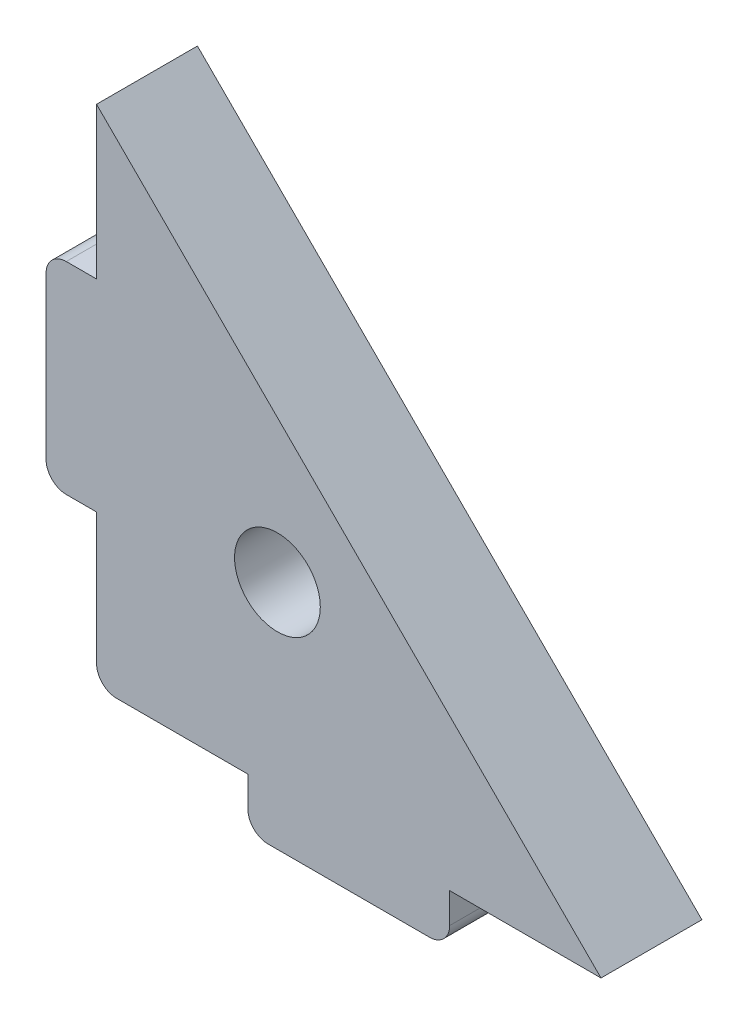
ISO-10303-21;
HEADER;
FILE_DESCRIPTION(('STEP AP214'),'2;1');
FILE_NAME('part.step','',(''),(''),'','','');
FILE_SCHEMA(('AUTOMOTIVE_DESIGN { 1 0 10303 214 1 1 1 1 }'));
ENDSEC;
DATA;
#1=APPLICATION_CONTEXT('core data for automotive mechanical design processes');
#2=APPLICATION_PROTOCOL_DEFINITION('international standard','automotive_design',2000,#1);
#3=PRODUCT_CONTEXT('',#1,'mechanical');
#4=PRODUCT('Part','Part','',(#3));
#5=PRODUCT_RELATED_PRODUCT_CATEGORY('part','',(#4));
#6=PRODUCT_DEFINITION_FORMATION('','',#4);
#7=PRODUCT_DEFINITION_CONTEXT('part definition',#1,'design');
#8=PRODUCT_DEFINITION('design','',#6,#7);
#9=PRODUCT_DEFINITION_SHAPE('','',#8);
#10=(LENGTH_UNIT() NAMED_UNIT(*) SI_UNIT(.MILLI.,.METRE.));
#11=(NAMED_UNIT(*) PLANE_ANGLE_UNIT() SI_UNIT($,.RADIAN.));
#12=(NAMED_UNIT(*) SI_UNIT($,.STERADIAN.) SOLID_ANGLE_UNIT());
#13=UNCERTAINTY_MEASURE_WITH_UNIT(LENGTH_MEASURE(1.E-05),#10,'distance_accuracy_value','');
#14=(GEOMETRIC_REPRESENTATION_CONTEXT(3) GLOBAL_UNCERTAINTY_ASSIGNED_CONTEXT((#13)) GLOBAL_UNIT_ASSIGNED_CONTEXT((#10,
#11,#12)) REPRESENTATION_CONTEXT('',''));
#15=CARTESIAN_POINT('',(0.,0.,0.));
#16=DIRECTION('',(0.,0.,1.));
#17=DIRECTION('',(1.,0.,0.));
#18=AXIS2_PLACEMENT_3D('',#15,#16,#17);
#19=CARTESIAN_POINT('',(0.,0.,10.));
#20=DIRECTION('',(0.,0.,1.));
#21=DIRECTION('',(1.,0.,0.));
#22=AXIS2_PLACEMENT_3D('',#19,#20,#21);
#23=PLANE('',#22);
#24=DIRECTION('',(0.,1.,0.));
#25=VECTOR('',#24,1.);
#26=CARTESIAN_POINT('',(-1.74702691181876,14.5393485831004,10.));
#27=LINE('',#26,#25);
#28=CARTESIAN_POINT('',(-1.74702691181876,16.5393485831004,10.));
#29=VERTEX_POINT('',#28);
#30=CARTESIAN_POINT('',(-1.74702691181876,29.5393485831004,10.));
#31=VERTEX_POINT('',#30);
#32=EDGE_CURVE('E186',#29,#31,#27,.T.);
#33=ORIENTED_EDGE('',*,*,#32,.F.);
#34=CARTESIAN_POINT('',(0.252973088181243,16.5393485831004,10.));
#35=DIRECTION('',(0.,0.,1.));
#36=DIRECTION('',(1.,0.,0.));
#37=AXIS2_PLACEMENT_3D('',#34,#35,#36);
#38=CIRCLE('',#37,2.);
#39=CARTESIAN_POINT('',(0.252973088181243,14.5393485831004,10.));
#40=VERTEX_POINT('',#39);
#41=EDGE_CURVE('E324',#29,#40,#38,.T.);
#42=ORIENTED_EDGE('',*,*,#41,.T.);
#43=DIRECTION('',(1.,0.,0.));
#44=VECTOR('',#43,1.);
#45=CARTESIAN_POINT('',(-1.74702691181876,14.5393485831004,10.));
#46=LINE('',#45,#44);
#47=CARTESIAN_POINT('',(13.2529730881812,14.5393485831004,10.));
#48=VERTEX_POINT('',#47);
#49=EDGE_CURVE('E204',#40,#48,#46,.T.);
#50=ORIENTED_EDGE('',*,*,#49,.T.);
#51=DIRECTION('',(0.,-1.,0.));
#52=VECTOR('',#51,1.);
#53=CARTESIAN_POINT('',(13.2529730881812,14.5393485831004,10.));
#54=LINE('',#53,#52);
#55=CARTESIAN_POINT('',(13.2529730881812,11.5393485831004,10.));
#56=VERTEX_POINT('',#55);
#57=EDGE_CURVE('E255',#48,#56,#54,.T.);
#58=ORIENTED_EDGE('',*,*,#57,.T.);
#59=CARTESIAN_POINT('',(15.2529730881812,11.5393485831004,10.));
#60=DIRECTION('',(0.,0.,1.));
#61=DIRECTION('',(1.,0.,0.));
#62=AXIS2_PLACEMENT_3D('',#59,#60,#61);
#63=CIRCLE('',#62,2.);
#64=CARTESIAN_POINT('',(15.2529730881812,9.53934858310044,10.));
#65=VERTEX_POINT('',#64);
#66=EDGE_CURVE('E226',#56,#65,#63,.T.);
#67=ORIENTED_EDGE('',*,*,#66,.T.);
#68=DIRECTION('',(1.,0.,0.));
#69=VECTOR('',#68,1.);
#70=CARTESIAN_POINT('',(13.2529730881812,9.53934858310044,10.));
#71=LINE('',#70,#69);
#72=CARTESIAN_POINT('',(31.2529730881812,9.53934858310044,10.));
#73=VERTEX_POINT('',#72);
#74=EDGE_CURVE('E251',#65,#73,#71,.T.);
#75=ORIENTED_EDGE('',*,*,#74,.T.);
#76=CARTESIAN_POINT('',(31.2529730881812,11.5393485831004,10.));
#77=DIRECTION('',(0.,0.,1.));
#78=DIRECTION('',(1.,0.,0.));
#79=AXIS2_PLACEMENT_3D('',#76,#77,#78);
#80=CIRCLE('',#79,2.);
#81=CARTESIAN_POINT('',(33.2529730881812,11.5393485831004,10.));
#82=VERTEX_POINT('',#81);
#83=EDGE_CURVE('E327',#73,#82,#80,.T.);
#84=ORIENTED_EDGE('',*,*,#83,.T.);
#85=DIRECTION('',(0.,-1.,0.));
#86=VECTOR('',#85,1.);
#87=CARTESIAN_POINT('',(33.2529730881812,14.5393485831004,10.));
#88=LINE('',#87,#86);
#89=CARTESIAN_POINT('',(33.2529730881812,14.5393485831004,10.));
#90=VERTEX_POINT('',#89);
#91=EDGE_CURVE('E247',#90,#82,#88,.T.);
#92=ORIENTED_EDGE('',*,*,#91,.F.);
#93=DIRECTION('',(1.,0.,0.));
#94=VECTOR('',#93,1.);
#95=CARTESIAN_POINT('',(33.2529730881812,14.5393485831004,10.));
#96=LINE('',#95,#94);
#97=CARTESIAN_POINT('',(48.2529730881797,14.5393485831004,10.));
#98=VERTEX_POINT('',#97);
#99=EDGE_CURVE('E240',#90,#98,#96,.T.);
#100=ORIENTED_EDGE('',*,*,#99,.T.);
#101=DIRECTION('',(-0.707106781186548,0.707106781186547,0.));
#102=VECTOR('',#101,1.);
#103=CARTESIAN_POINT('',(48.2529730881797,14.5393485831004,10.));
#104=LINE('',#103,#102);
#105=CARTESIAN_POINT('',(-1.74702691181876,64.5393485830988,10.));
#106=VERTEX_POINT('',#105);
#107=EDGE_CURVE('E237',#98,#106,#104,.T.);
#108=ORIENTED_EDGE('',*,*,#107,.T.);
#109=DIRECTION('',(0.,-1.,0.));
#110=VECTOR('',#109,1.);
#111=CARTESIAN_POINT('',(-1.74702691181876,64.5393485830988,10.));
#112=LINE('',#111,#110);
#113=CARTESIAN_POINT('',(-1.74702691181876,49.5393485831004,10.));
#114=VERTEX_POINT('',#113);
#115=EDGE_CURVE('E234',#106,#114,#112,.T.);
#116=ORIENTED_EDGE('',*,*,#115,.T.);
#117=DIRECTION('',(-1.,0.,0.));
#118=VECTOR('',#117,1.);
#119=CARTESIAN_POINT('',(-1.74702691181876,49.5393485831004,10.));
#120=LINE('',#119,#118);
#121=CARTESIAN_POINT('',(-4.74702691181876,49.5393485831004,10.));
#122=VERTEX_POINT('',#121);
#123=EDGE_CURVE('E209',#114,#122,#120,.T.);
#124=ORIENTED_EDGE('',*,*,#123,.T.);
#125=CARTESIAN_POINT('',(-4.74702691181876,47.5393485831004,10.));
#126=DIRECTION('',(0.,0.,1.));
#127=DIRECTION('',(1.,0.,0.));
#128=AXIS2_PLACEMENT_3D('',#125,#126,#127);
#129=CIRCLE('',#128,2.);
#130=CARTESIAN_POINT('',(-6.74702691181876,47.5393485831004,10.));
#131=VERTEX_POINT('',#130);
#132=EDGE_CURVE('E92',#122,#131,#129,.T.);
#133=ORIENTED_EDGE('',*,*,#132,.T.);
#134=DIRECTION('',(0.,1.,0.));
#135=VECTOR('',#134,1.);
#136=CARTESIAN_POINT('',(-6.74702691181875,29.5393485831004,10.));
#137=LINE('',#136,#135);
#138=CARTESIAN_POINT('',(-6.74702691181875,31.5393485831004,10.));
#139=VERTEX_POINT('',#138);
#140=EDGE_CURVE('E207',#139,#131,#137,.T.);
#141=ORIENTED_EDGE('',*,*,#140,.F.);
#142=CARTESIAN_POINT('',(-4.74702691181875,31.5393485831004,10.));
#143=DIRECTION('',(0.,0.,1.));
#144=DIRECTION('',(1.,0.,0.));
#145=AXIS2_PLACEMENT_3D('',#142,#143,#144);
#146=CIRCLE('',#145,2.);
#147=CARTESIAN_POINT('',(-4.74702691181875,29.5393485831004,10.));
#148=VERTEX_POINT('',#147);
#149=EDGE_CURVE('E86',#139,#148,#146,.T.);
#150=ORIENTED_EDGE('',*,*,#149,.T.);
#151=DIRECTION('',(-1.,0.,0.));
#152=VECTOR('',#151,1.);
#153=CARTESIAN_POINT('',(-1.74702691181876,29.5393485831004,10.));
#154=LINE('',#153,#152);
#155=EDGE_CURVE('E195',#31,#148,#154,.T.);
#156=ORIENTED_EDGE('',*,*,#155,.F.);
#157=EDGE_LOOP('',(#33,#42,#50,#58,#67,#75,#84,#92,#100,#108,#116,#124,#133,#141,#150,#156));
#158=FACE_BOUND('',#157,.T.);
#159=CARTESIAN_POINT('',(16.181905276315,32.4682807712342,10.));
#160=DIRECTION('',(0.,0.,1.));
#161=DIRECTION('',(1.,0.,0.));
#162=AXIS2_PLACEMENT_3D('',#159,#160,#161);
#163=CIRCLE('',#162,4.25);
#164=CARTESIAN_POINT('',(20.431905276315,32.4682807712342,10.));
#165=VERTEX_POINT('',#164);
#166=EDGE_CURVE('E268',#165,#165,#163,.T.);
#167=ORIENTED_EDGE('',*,*,#166,.F.);
#168=EDGE_LOOP('',(#167));
#169=FACE_BOUND('',#168,.T.);
#170=ADVANCED_FACE('F71',(#158,#169),#23,.T.);
#171=CARTESIAN_POINT('',(0.,0.,0.));
#172=DIRECTION('',(0.,0.,1.));
#173=DIRECTION('',(1.,0.,0.));
#174=AXIS2_PLACEMENT_3D('',#171,#172,#173);
#175=PLANE('',#174);
#176=DIRECTION('',(1.,0.,0.));
#177=VECTOR('',#176,1.);
#178=CARTESIAN_POINT('',(-1.74702691181876,14.5393485831004,0.));
#179=LINE('',#178,#177);
#180=CARTESIAN_POINT('',(0.252973088181243,14.5393485831004,0.));
#181=VERTEX_POINT('',#180);
#182=CARTESIAN_POINT('',(13.2529730881812,14.5393485831004,0.));
#183=VERTEX_POINT('',#182);
#184=EDGE_CURVE('E196',#181,#183,#179,.T.);
#185=ORIENTED_EDGE('',*,*,#184,.F.);
#186=CARTESIAN_POINT('',(0.252973088181243,16.5393485831004,0.));
#187=DIRECTION('',(0.,0.,1.));
#188=DIRECTION('',(1.,0.,0.));
#189=AXIS2_PLACEMENT_3D('',#186,#187,#188);
#190=CIRCLE('',#189,2.);
#191=CARTESIAN_POINT('',(-1.74702691181876,16.5393485831004,0.));
#192=VERTEX_POINT('',#191);
#193=EDGE_CURVE('E315',#181,#192,#190,.F.);
#194=ORIENTED_EDGE('',*,*,#193,.T.);
#195=DIRECTION('',(0.,1.,0.));
#196=VECTOR('',#195,1.);
#197=CARTESIAN_POINT('',(-1.74702691181876,14.5393485831004,0.));
#198=LINE('',#197,#196);
#199=CARTESIAN_POINT('',(-1.74702691181876,29.5393485831004,0.));
#200=VERTEX_POINT('',#199);
#201=EDGE_CURVE('E266',#192,#200,#198,.T.);
#202=ORIENTED_EDGE('',*,*,#201,.T.);
#203=DIRECTION('',(-1.,0.,0.));
#204=VECTOR('',#203,1.);
#205=CARTESIAN_POINT('',(-1.74702691181876,29.5393485831004,0.));
#206=LINE('',#205,#204);
#207=CARTESIAN_POINT('',(-4.74702691181875,29.5393485831004,0.));
#208=VERTEX_POINT('',#207);
#209=EDGE_CURVE('E202',#200,#208,#206,.T.);
#210=ORIENTED_EDGE('',*,*,#209,.T.);
#211=CARTESIAN_POINT('',(-4.74702691181875,31.5393485831004,0.));
#212=DIRECTION('',(0.,0.,1.));
#213=DIRECTION('',(1.,0.,0.));
#214=AXIS2_PLACEMENT_3D('',#211,#212,#213);
#215=CIRCLE('',#214,2.);
#216=CARTESIAN_POINT('',(-6.74702691181875,31.5393485831004,0.));
#217=VERTEX_POINT('',#216);
#218=EDGE_CURVE('E308',#208,#217,#215,.F.);
#219=ORIENTED_EDGE('',*,*,#218,.T.);
#220=DIRECTION('',(0.,1.,0.));
#221=VECTOR('',#220,1.);
#222=CARTESIAN_POINT('',(-6.74702691181875,29.5393485831004,0.));
#223=LINE('',#222,#221);
#224=CARTESIAN_POINT('',(-6.74702691181876,47.5393485831004,0.));
#225=VERTEX_POINT('',#224);
#226=EDGE_CURVE('E270',#217,#225,#223,.T.);
#227=ORIENTED_EDGE('',*,*,#226,.T.);
#228=CARTESIAN_POINT('',(-4.74702691181876,47.5393485831004,0.));
#229=DIRECTION('',(0.,0.,1.));
#230=DIRECTION('',(1.,0.,0.));
#231=AXIS2_PLACEMENT_3D('',#228,#229,#230);
#232=CIRCLE('',#231,2.);
#233=CARTESIAN_POINT('',(-4.74702691181876,49.5393485831004,0.));
#234=VERTEX_POINT('',#233);
#235=EDGE_CURVE('E310',#225,#234,#232,.F.);
#236=ORIENTED_EDGE('',*,*,#235,.T.);
#237=DIRECTION('',(-1.,0.,0.));
#238=VECTOR('',#237,1.);
#239=CARTESIAN_POINT('',(-1.74702691181876,49.5393485831004,0.));
#240=LINE('',#239,#238);
#241=CARTESIAN_POINT('',(-1.74702691181876,49.5393485831004,0.));
#242=VERTEX_POINT('',#241);
#243=EDGE_CURVE('E273',#242,#234,#240,.T.);
#244=ORIENTED_EDGE('',*,*,#243,.F.);
#245=DIRECTION('',(0.,-1.,0.));
#246=VECTOR('',#245,1.);
#247=CARTESIAN_POINT('',(-1.74702691181876,64.5393485830988,0.));
#248=LINE('',#247,#246);
#249=CARTESIAN_POINT('',(-1.74702691181876,64.5393485830988,0.));
#250=VERTEX_POINT('',#249);
#251=EDGE_CURVE('E276',#250,#242,#248,.T.);
#252=ORIENTED_EDGE('',*,*,#251,.F.);
#253=DIRECTION('',(-0.707106781186548,0.707106781186547,0.));
#254=VECTOR('',#253,1.);
#255=CARTESIAN_POINT('',(48.2529730881797,14.5393485831004,0.));
#256=LINE('',#255,#254);
#257=CARTESIAN_POINT('',(48.2529730881797,14.5393485831004,0.));
#258=VERTEX_POINT('',#257);
#259=EDGE_CURVE('E278',#258,#250,#256,.T.);
#260=ORIENTED_EDGE('',*,*,#259,.F.);
#261=DIRECTION('',(1.,0.,0.));
#262=VECTOR('',#261,1.);
#263=CARTESIAN_POINT('',(33.2529730881812,14.5393485831004,0.));
#264=LINE('',#263,#262);
#265=CARTESIAN_POINT('',(33.2529730881812,14.5393485831004,0.));
#266=VERTEX_POINT('',#265);
#267=EDGE_CURVE('E280',#266,#258,#264,.T.);
#268=ORIENTED_EDGE('',*,*,#267,.F.);
#269=DIRECTION('',(0.,-1.,0.));
#270=VECTOR('',#269,1.);
#271=CARTESIAN_POINT('',(33.2529730881812,14.5393485831004,0.));
#272=LINE('',#271,#270);
#273=CARTESIAN_POINT('',(33.2529730881812,11.5393485831004,0.));
#274=VERTEX_POINT('',#273);
#275=EDGE_CURVE('E282',#266,#274,#272,.T.);
#276=ORIENTED_EDGE('',*,*,#275,.T.);
#277=CARTESIAN_POINT('',(31.2529730881812,11.5393485831004,0.));
#278=DIRECTION('',(0.,0.,1.));
#279=DIRECTION('',(1.,0.,0.));
#280=AXIS2_PLACEMENT_3D('',#277,#278,#279);
#281=CIRCLE('',#280,2.);
#282=CARTESIAN_POINT('',(31.2529730881812,9.53934858310044,0.));
#283=VERTEX_POINT('',#282);
#284=EDGE_CURVE('E314',#274,#283,#281,.F.);
#285=ORIENTED_EDGE('',*,*,#284,.T.);
#286=DIRECTION('',(1.,0.,0.));
#287=VECTOR('',#286,1.);
#288=CARTESIAN_POINT('',(13.2529730881812,9.53934858310044,0.));
#289=LINE('',#288,#287);
#290=CARTESIAN_POINT('',(15.2529730881812,9.53934858310044,0.));
#291=VERTEX_POINT('',#290);
#292=EDGE_CURVE('E285',#291,#283,#289,.T.);
#293=ORIENTED_EDGE('',*,*,#292,.F.);
#294=CARTESIAN_POINT('',(15.2529730881812,11.5393485831004,0.));
#295=DIRECTION('',(0.,0.,1.));
#296=DIRECTION('',(1.,0.,0.));
#297=AXIS2_PLACEMENT_3D('',#294,#295,#296);
#298=CIRCLE('',#297,2.);
#299=CARTESIAN_POINT('',(13.2529730881812,11.5393485831004,0.));
#300=VERTEX_POINT('',#299);
#301=EDGE_CURVE('E312',#291,#300,#298,.F.);
#302=ORIENTED_EDGE('',*,*,#301,.T.);
#303=DIRECTION('',(0.,-1.,0.));
#304=VECTOR('',#303,1.);
#305=CARTESIAN_POINT('',(13.2529730881812,14.5393485831004,0.));
#306=LINE('',#305,#304);
#307=EDGE_CURVE('E288',#183,#300,#306,.T.);
#308=ORIENTED_EDGE('',*,*,#307,.F.);
#309=EDGE_LOOP('',(#185,#194,#202,#210,#219,#227,#236,#244,#252,#260,#268,#276,#285,#293,#302,#308));
#310=FACE_BOUND('',#309,.T.);
#311=CARTESIAN_POINT('',(16.181905276315,32.4682807712342,0.));
#312=DIRECTION('',(0.,0.,1.));
#313=DIRECTION('',(1.,0.,0.));
#314=AXIS2_PLACEMENT_3D('',#311,#312,#313);
#315=CIRCLE('',#314,4.25);
#316=CARTESIAN_POINT('',(20.431905276315,32.4682807712342,0.));
#317=VERTEX_POINT('',#316);
#318=EDGE_CURVE('E554',#317,#317,#315,.T.);
#319=ORIENTED_EDGE('',*,*,#318,.T.);
#320=EDGE_LOOP('',(#319));
#321=FACE_BOUND('',#320,.T.);
#322=ADVANCED_FACE('F318',(#310,#321),#175,.F.);
#323=CARTESIAN_POINT('',(-1.74702691181876,14.5393485831004,10.));
#324=DIRECTION('',(-1.,0.,0.));
#325=DIRECTION('',(0.,-1.,0.));
#326=AXIS2_PLACEMENT_3D('',#323,#324,#325);
#327=PLANE('',#326);
#328=ORIENTED_EDGE('',*,*,#201,.F.);
#329=DIRECTION('',(0.,0.,-1.));
#330=VECTOR('',#329,1.);
#331=CARTESIAN_POINT('',(-1.74702691181876,16.5393485831004,10.));
#332=LINE('',#331,#330);
#333=EDGE_CURVE('E193',#192,#29,#332,.F.);
#334=ORIENTED_EDGE('',*,*,#333,.T.);
#335=ORIENTED_EDGE('',*,*,#32,.T.);
#336=DIRECTION('',(0.,0.,-1.));
#337=VECTOR('',#336,1.);
#338=CARTESIAN_POINT('',(-1.74702691181876,29.5393485831004,10.));
#339=LINE('',#338,#337);
#340=EDGE_CURVE('E190',#31,#200,#339,.T.);
#341=ORIENTED_EDGE('',*,*,#340,.T.);
#342=EDGE_LOOP('',(#328,#334,#335,#341));
#343=FACE_BOUND('',#342,.T.);
#344=ADVANCED_FACE('F189',(#343),#327,.T.);
#345=CARTESIAN_POINT('',(-1.74702691181876,14.5393485831004,10.));
#346=DIRECTION('',(0.,1.,0.));
#347=DIRECTION('',(-1.,0.,0.));
#348=AXIS2_PLACEMENT_3D('',#345,#346,#347);
#349=PLANE('',#348);
#350=ORIENTED_EDGE('',*,*,#49,.F.);
#351=DIRECTION('',(0.,0.,-1.));
#352=VECTOR('',#351,1.);
#353=CARTESIAN_POINT('',(0.252973088181243,14.5393485831004,0.));
#354=LINE('',#353,#352);
#355=EDGE_CURVE('E295',#40,#181,#354,.T.);
#356=ORIENTED_EDGE('',*,*,#355,.T.);
#357=ORIENTED_EDGE('',*,*,#184,.T.);
#358=DIRECTION('',(0.,0.,-1.));
#359=VECTOR('',#358,1.);
#360=CARTESIAN_POINT('',(13.2529730881812,14.5393485831004,10.));
#361=LINE('',#360,#359);
#362=EDGE_CURVE('E292',#48,#183,#361,.T.);
#363=ORIENTED_EDGE('',*,*,#362,.F.);
#364=EDGE_LOOP('',(#350,#356,#357,#363));
#365=FACE_BOUND('',#364,.T.);
#366=ADVANCED_FACE('F373',(#365),#349,.F.);
#367=CARTESIAN_POINT('',(13.2529730881812,14.5393485831004,10.));
#368=DIRECTION('',(1.,0.,0.));
#369=DIRECTION('',(0.,0.,-1.));
#370=AXIS2_PLACEMENT_3D('',#367,#368,#369);
#371=PLANE('',#370);
#372=ORIENTED_EDGE('',*,*,#307,.T.);
#373=DIRECTION('',(0.,0.,-1.));
#374=VECTOR('',#373,1.);
#375=CARTESIAN_POINT('',(13.2529730881812,11.5393485831004,10.));
#376=LINE('',#375,#374);
#377=EDGE_CURVE('E338',#300,#56,#376,.F.);
#378=ORIENTED_EDGE('',*,*,#377,.T.);
#379=ORIENTED_EDGE('',*,*,#57,.F.);
#380=ORIENTED_EDGE('',*,*,#362,.T.);
#381=EDGE_LOOP('',(#372,#378,#379,#380));
#382=FACE_BOUND('',#381,.T.);
#383=ADVANCED_FACE('F376',(#382),#371,.F.);
#384=CARTESIAN_POINT('',(13.2529730881812,9.53934858310044,10.));
#385=DIRECTION('',(0.,1.,0.));
#386=DIRECTION('',(0.,0.,1.));
#387=AXIS2_PLACEMENT_3D('',#384,#385,#386);
#388=PLANE('',#387);
#389=ORIENTED_EDGE('',*,*,#292,.T.);
#390=DIRECTION('',(0.,0.,-1.));
#391=VECTOR('',#390,1.);
#392=CARTESIAN_POINT('',(31.2529730881812,9.53934858310044,10.));
#393=LINE('',#392,#391);
#394=EDGE_CURVE('E336',#283,#73,#393,.F.);
#395=ORIENTED_EDGE('',*,*,#394,.T.);
#396=ORIENTED_EDGE('',*,*,#74,.F.);
#397=DIRECTION('',(0.,0.,-1.));
#398=VECTOR('',#397,1.);
#399=CARTESIAN_POINT('',(15.2529730881812,9.53934858310044,10.));
#400=LINE('',#399,#398);
#401=EDGE_CURVE('E329',#65,#291,#400,.T.);
#402=ORIENTED_EDGE('',*,*,#401,.T.);
#403=EDGE_LOOP('',(#389,#395,#396,#402));
#404=FACE_BOUND('',#403,.T.);
#405=ADVANCED_FACE('F380',(#404),#388,.F.);
#406=CARTESIAN_POINT('',(33.2529730881812,14.5393485831004,10.));
#407=DIRECTION('',(1.,0.,0.));
#408=DIRECTION('',(0.,0.,-1.));
#409=AXIS2_PLACEMENT_3D('',#406,#407,#408);
#410=PLANE('',#409);
#411=ORIENTED_EDGE('',*,*,#91,.T.);
#412=DIRECTION('',(0.,0.,-1.));
#413=VECTOR('',#412,1.);
#414=CARTESIAN_POINT('',(33.2529730881812,11.5393485831004,0.));
#415=LINE('',#414,#413);
#416=EDGE_CURVE('E326',#82,#274,#415,.T.);
#417=ORIENTED_EDGE('',*,*,#416,.T.);
#418=ORIENTED_EDGE('',*,*,#275,.F.);
#419=DIRECTION('',(0.,0.,-1.));
#420=VECTOR('',#419,1.);
#421=CARTESIAN_POINT('',(33.2529730881812,14.5393485831004,10.));
#422=LINE('',#421,#420);
#423=EDGE_CURVE('E296',#90,#266,#422,.T.);
#424=ORIENTED_EDGE('',*,*,#423,.F.);
#425=EDGE_LOOP('',(#411,#417,#418,#424));
#426=FACE_BOUND('',#425,.T.);
#427=ADVANCED_FACE('F384',(#426),#410,.T.);
#428=CARTESIAN_POINT('',(33.2529730881812,14.5393485831004,10.));
#429=DIRECTION('',(0.,1.,0.));
#430=DIRECTION('',(0.,0.,1.));
#431=AXIS2_PLACEMENT_3D('',#428,#429,#430);
#432=PLANE('',#431);
#433=ORIENTED_EDGE('',*,*,#267,.T.);
#434=DIRECTION('',(0.,0.,-1.));
#435=VECTOR('',#434,1.);
#436=CARTESIAN_POINT('',(48.2529730881797,14.5393485831004,10.));
#437=LINE('',#436,#435);
#438=EDGE_CURVE('E298',#98,#258,#437,.T.);
#439=ORIENTED_EDGE('',*,*,#438,.F.);
#440=ORIENTED_EDGE('',*,*,#99,.F.);
#441=ORIENTED_EDGE('',*,*,#423,.T.);
#442=EDGE_LOOP('',(#433,#439,#440,#441));
#443=FACE_BOUND('',#442,.T.);
#444=ADVANCED_FACE('F388',(#443),#432,.F.);
#445=CARTESIAN_POINT('',(48.2529730881797,14.5393485831004,10.));
#446=DIRECTION('',(-0.707106781186547,-0.707106781186548,0.));
#447=DIRECTION('',(0.707106781186548,-0.707106781186547,0.));
#448=AXIS2_PLACEMENT_3D('',#445,#446,#447);
#449=PLANE('',#448);
#450=ORIENTED_EDGE('',*,*,#259,.T.);
#451=DIRECTION('',(0.,0.,-1.));
#452=VECTOR('',#451,1.);
#453=CARTESIAN_POINT('',(-1.74702691181876,64.5393485830988,10.));
#454=LINE('',#453,#452);
#455=EDGE_CURVE('E301',#106,#250,#454,.T.);
#456=ORIENTED_EDGE('',*,*,#455,.F.);
#457=ORIENTED_EDGE('',*,*,#107,.F.);
#458=ORIENTED_EDGE('',*,*,#438,.T.);
#459=EDGE_LOOP('',(#450,#456,#457,#458));
#460=FACE_BOUND('',#459,.T.);
#461=ADVANCED_FACE('F392',(#460),#449,.F.);
#462=CARTESIAN_POINT('',(-1.74702691181876,64.5393485830988,10.));
#463=DIRECTION('',(1.,0.,0.));
#464=DIRECTION('',(0.,0.,-1.));
#465=AXIS2_PLACEMENT_3D('',#462,#463,#464);
#466=PLANE('',#465);
#467=ORIENTED_EDGE('',*,*,#251,.T.);
#468=DIRECTION('',(0.,0.,-1.));
#469=VECTOR('',#468,1.);
#470=CARTESIAN_POINT('',(-1.74702691181876,49.5393485831004,10.));
#471=LINE('',#470,#469);
#472=EDGE_CURVE('E203',#114,#242,#471,.T.);
#473=ORIENTED_EDGE('',*,*,#472,.F.);
#474=ORIENTED_EDGE('',*,*,#115,.F.);
#475=ORIENTED_EDGE('',*,*,#455,.T.);
#476=EDGE_LOOP('',(#467,#473,#474,#475));
#477=FACE_BOUND('',#476,.T.);
#478=ADVANCED_FACE('F396',(#477),#466,.F.);
#479=CARTESIAN_POINT('',(-1.74702691181876,49.5393485831004,10.));
#480=DIRECTION('',(0.,-1.,0.));
#481=DIRECTION('',(1.,0.,0.));
#482=AXIS2_PLACEMENT_3D('',#479,#480,#481);
#483=PLANE('',#482);
#484=ORIENTED_EDGE('',*,*,#243,.T.);
#485=DIRECTION('',(0.,0.,-1.));
#486=VECTOR('',#485,1.);
#487=CARTESIAN_POINT('',(-4.74702691181876,49.5393485831004,10.));
#488=LINE('',#487,#486);
#489=EDGE_CURVE('E79',#234,#122,#488,.F.);
#490=ORIENTED_EDGE('',*,*,#489,.T.);
#491=ORIENTED_EDGE('',*,*,#123,.F.);
#492=ORIENTED_EDGE('',*,*,#472,.T.);
#493=EDGE_LOOP('',(#484,#490,#491,#492));
#494=FACE_BOUND('',#493,.T.);
#495=ADVANCED_FACE('F347',(#494),#483,.F.);
#496=CARTESIAN_POINT('',(-6.74702691181875,29.5393485831004,10.));
#497=DIRECTION('',(-1.,0.,0.));
#498=DIRECTION('',(0.,-1.,0.));
#499=AXIS2_PLACEMENT_3D('',#496,#497,#498);
#500=PLANE('',#499);
#501=ORIENTED_EDGE('',*,*,#140,.T.);
#502=DIRECTION('',(0.,0.,-1.));
#503=VECTOR('',#502,1.);
#504=CARTESIAN_POINT('',(-6.74702691181876,47.5393485831004,0.));
#505=LINE('',#504,#503);
#506=EDGE_CURVE('E342',#131,#225,#505,.T.);
#507=ORIENTED_EDGE('',*,*,#506,.T.);
#508=ORIENTED_EDGE('',*,*,#226,.F.);
#509=DIRECTION('',(0.,0.,-1.));
#510=VECTOR('',#509,1.);
#511=CARTESIAN_POINT('',(-6.74702691181875,31.5393485831004,10.));
#512=LINE('',#511,#510);
#513=EDGE_CURVE('E340',#217,#139,#512,.F.);
#514=ORIENTED_EDGE('',*,*,#513,.T.);
#515=EDGE_LOOP('',(#501,#507,#508,#514));
#516=FACE_BOUND('',#515,.T.);
#517=ADVANCED_FACE('F356',(#516),#500,.T.);
#518=CARTESIAN_POINT('',(-1.74702691181876,29.5393485831004,10.));
#519=DIRECTION('',(0.,-1.,0.));
#520=DIRECTION('',(1.,0.,0.));
#521=AXIS2_PLACEMENT_3D('',#518,#519,#520);
#522=PLANE('',#521);
#523=ORIENTED_EDGE('',*,*,#155,.T.);
#524=DIRECTION('',(0.,0.,-1.));
#525=VECTOR('',#524,1.);
#526=CARTESIAN_POINT('',(-4.74702691181875,29.5393485831004,10.));
#527=LINE('',#526,#525);
#528=EDGE_CURVE('E13',#148,#208,#527,.T.);
#529=ORIENTED_EDGE('',*,*,#528,.T.);
#530=ORIENTED_EDGE('',*,*,#209,.F.);
#531=ORIENTED_EDGE('',*,*,#340,.F.);
#532=EDGE_LOOP('',(#523,#529,#530,#531));
#533=FACE_BOUND('',#532,.T.);
#534=ADVANCED_FACE('F199',(#533),#522,.T.);
#535=CARTESIAN_POINT('',(16.181905276315,32.4682807712342,10.));
#536=DIRECTION('',(0.,0.,-1.));
#537=DIRECTION('',(-1.,0.,0.));
#538=AXIS2_PLACEMENT_3D('',#535,#536,#537);
#539=CYLINDRICAL_SURFACE('',#538,4.25);
#540=ORIENTED_EDGE('',*,*,#166,.T.);
#541=EDGE_LOOP('',(#540));
#542=FACE_BOUND('',#541,.T.);
#543=ORIENTED_EDGE('',*,*,#318,.F.);
#544=EDGE_LOOP('',(#543));
#545=FACE_BOUND('',#544,.T.);
#546=ADVANCED_FACE('F371',(#542,#545),#539,.F.);
#547=CARTESIAN_POINT('',(0.252973088181243,16.5393485831004,10.));
#548=DIRECTION('',(0.,0.,1.));
#549=DIRECTION('',(1.,0.,0.));
#550=AXIS2_PLACEMENT_3D('',#547,#548,#549);
#551=CYLINDRICAL_SURFACE('',#550,2.);
#552=ORIENTED_EDGE('',*,*,#41,.F.);
#553=ORIENTED_EDGE('',*,*,#333,.F.);
#554=ORIENTED_EDGE('',*,*,#193,.F.);
#555=ORIENTED_EDGE('',*,*,#355,.F.);
#556=EDGE_LOOP('',(#552,#553,#554,#555));
#557=FACE_BOUND('',#556,.T.);
#558=ADVANCED_FACE('F323',(#557),#551,.T.);
#559=CARTESIAN_POINT('',(31.2529730881812,11.5393485831004,10.));
#560=DIRECTION('',(0.,0.,1.));
#561=DIRECTION('',(1.,0.,0.));
#562=AXIS2_PLACEMENT_3D('',#559,#560,#561);
#563=CYLINDRICAL_SURFACE('',#562,2.);
#564=ORIENTED_EDGE('',*,*,#83,.F.);
#565=ORIENTED_EDGE('',*,*,#394,.F.);
#566=ORIENTED_EDGE('',*,*,#284,.F.);
#567=ORIENTED_EDGE('',*,*,#416,.F.);
#568=EDGE_LOOP('',(#564,#565,#566,#567));
#569=FACE_BOUND('',#568,.T.);
#570=ADVANCED_FACE('F411',(#569),#563,.T.);
#571=CARTESIAN_POINT('',(15.2529730881812,11.5393485831004,10.));
#572=DIRECTION('',(0.,0.,-1.));
#573=DIRECTION('',(-1.,0.,0.));
#574=AXIS2_PLACEMENT_3D('',#571,#572,#573);
#575=CYLINDRICAL_SURFACE('',#574,2.);
#576=ORIENTED_EDGE('',*,*,#66,.F.);
#577=ORIENTED_EDGE('',*,*,#377,.F.);
#578=ORIENTED_EDGE('',*,*,#301,.F.);
#579=ORIENTED_EDGE('',*,*,#401,.F.);
#580=EDGE_LOOP('',(#576,#577,#578,#579));
#581=FACE_BOUND('',#580,.T.);
#582=ADVANCED_FACE('F363',(#581),#575,.T.);
#583=CARTESIAN_POINT('',(-4.74702691181876,47.5393485831004,10.));
#584=DIRECTION('',(0.,0.,1.));
#585=DIRECTION('',(1.,0.,0.));
#586=AXIS2_PLACEMENT_3D('',#583,#584,#585);
#587=CYLINDRICAL_SURFACE('',#586,2.);
#588=ORIENTED_EDGE('',*,*,#132,.F.);
#589=ORIENTED_EDGE('',*,*,#489,.F.);
#590=ORIENTED_EDGE('',*,*,#235,.F.);
#591=ORIENTED_EDGE('',*,*,#506,.F.);
#592=EDGE_LOOP('',(#588,#589,#590,#591));
#593=FACE_BOUND('',#592,.T.);
#594=ADVANCED_FACE('F353',(#593),#587,.T.);
#595=CARTESIAN_POINT('',(-4.74702691181875,31.5393485831004,10.));
#596=DIRECTION('',(0.,0.,-1.));
#597=DIRECTION('',(-1.,0.,0.));
#598=AXIS2_PLACEMENT_3D('',#595,#596,#597);
#599=CYLINDRICAL_SURFACE('',#598,2.);
#600=ORIENTED_EDGE('',*,*,#149,.F.);
#601=ORIENTED_EDGE('',*,*,#513,.F.);
#602=ORIENTED_EDGE('',*,*,#218,.F.);
#603=ORIENTED_EDGE('',*,*,#528,.F.);
#604=EDGE_LOOP('',(#600,#601,#602,#603));
#605=FACE_BOUND('',#604,.T.);
#606=ADVANCED_FACE('F73',(#605),#599,.T.);
#607=CLOSED_SHELL('',(#170,#322,#344,#366,#383,#405,#427,#444,#461,#478,#495,#517,#534,#546,
#558,#570,#582,#594,#606));
#608=MANIFOLD_SOLID_BREP('B2',#607);
#609=ADVANCED_BREP_SHAPE_REPRESENTATION('',(#18,#608),#14);
#610=SHAPE_DEFINITION_REPRESENTATION(#9,#609);
ENDSEC;
END-ISO-10303-21;
